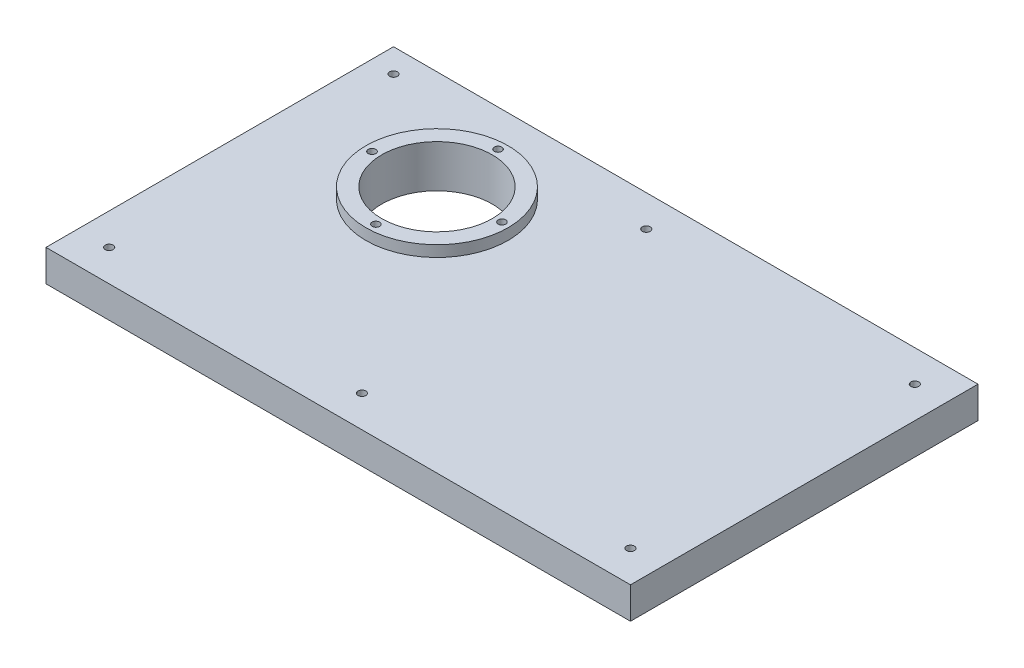
ISO-10303-21;
HEADER;
FILE_DESCRIPTION(('STEP AP214'),'2;1');
FILE_NAME('part.step','',(''),(''),'','','');
FILE_SCHEMA(('AUTOMOTIVE_DESIGN { 1 0 10303 214 1 1 1 1 }'));
ENDSEC;
DATA;
#1=APPLICATION_CONTEXT('core data for automotive mechanical design processes');
#2=APPLICATION_PROTOCOL_DEFINITION('international standard','automotive_design',2000,#1);
#3=PRODUCT_CONTEXT('',#1,'mechanical');
#4=PRODUCT('Part','Part','',(#3));
#5=PRODUCT_RELATED_PRODUCT_CATEGORY('part','',(#4));
#6=PRODUCT_DEFINITION_FORMATION('','',#4);
#7=PRODUCT_DEFINITION_CONTEXT('part definition',#1,'design');
#8=PRODUCT_DEFINITION('design','',#6,#7);
#9=PRODUCT_DEFINITION_SHAPE('','',#8);
#10=(LENGTH_UNIT() NAMED_UNIT(*) SI_UNIT(.MILLI.,.METRE.));
#11=(NAMED_UNIT(*) PLANE_ANGLE_UNIT() SI_UNIT($,.RADIAN.));
#12=(NAMED_UNIT(*) SI_UNIT($,.STERADIAN.) SOLID_ANGLE_UNIT());
#13=UNCERTAINTY_MEASURE_WITH_UNIT(LENGTH_MEASURE(1.E-05),#10,'distance_accuracy_value','');
#14=(GEOMETRIC_REPRESENTATION_CONTEXT(3) GLOBAL_UNCERTAINTY_ASSIGNED_CONTEXT((#13)) GLOBAL_UNIT_ASSIGNED_CONTEXT((#10,
#11,#12)) REPRESENTATION_CONTEXT('',''));
#15=CARTESIAN_POINT('',(0.,0.,0.));
#16=DIRECTION('',(0.,0.,1.));
#17=DIRECTION('',(1.,0.,0.));
#18=AXIS2_PLACEMENT_3D('',#15,#16,#17);
#19=CARTESIAN_POINT('',(0.,0.,0.));
#20=DIRECTION('',(0.,1.,0.));
#21=DIRECTION('',(0.,0.,1.));
#22=AXIS2_PLACEMENT_3D('',#19,#20,#21);
#23=PLANE('',#22);
#24=CARTESIAN_POINT('',(15.,0.,-3.98961965134706));
#25=DIRECTION('',(0.,1.,0.));
#26=DIRECTION('',(0.,0.,1.));
#27=AXIS2_PLACEMENT_3D('',#24,#25,#26);
#28=CIRCLE('',#27,2.5);
#29=CARTESIAN_POINT('',(15.,0.,-1.48961965134706));
#30=VERTEX_POINT('',#29);
#31=EDGE_CURVE('E372',#30,#30,#28,.T.);
#32=ORIENTED_EDGE('',*,*,#31,.T.);
#33=EDGE_LOOP('',(#32));
#34=FACE_BOUND('',#33,.T.);
#35=CARTESIAN_POINT('',(20.,0.,181.010380348653));
#36=DIRECTION('',(0.,1.,0.));
#37=DIRECTION('',(0.,0.,1.));
#38=AXIS2_PLACEMENT_3D('',#35,#36,#37);
#39=CIRCLE('',#38,2.5);
#40=CARTESIAN_POINT('',(20.,0.,183.510380348653));
#41=VERTEX_POINT('',#40);
#42=EDGE_CURVE('E366',#41,#41,#39,.T.);
#43=ORIENTED_EDGE('',*,*,#42,.T.);
#44=EDGE_LOOP('',(#43));
#45=FACE_BOUND('',#44,.T.);
#46=CARTESIAN_POINT('',(350.,0.,1.01038034865295));
#47=DIRECTION('',(0.,1.,0.));
#48=DIRECTION('',(0.,0.,1.));
#49=AXIS2_PLACEMENT_3D('',#46,#47,#48);
#50=CIRCLE('',#49,2.50000000000002);
#51=CARTESIAN_POINT('',(350.,0.,3.51038034865297));
#52=VERTEX_POINT('',#51);
#53=EDGE_CURVE('E360',#52,#52,#50,.T.);
#54=ORIENTED_EDGE('',*,*,#53,.T.);
#55=EDGE_LOOP('',(#54));
#56=FACE_BOUND('',#55,.T.);
#57=CARTESIAN_POINT('',(350.,0.,181.010380348653));
#58=DIRECTION('',(0.,1.,0.));
#59=DIRECTION('',(0.,0.,1.));
#60=AXIS2_PLACEMENT_3D('',#57,#58,#59);
#61=CIRCLE('',#60,2.50000000000002);
#62=CARTESIAN_POINT('',(350.,0.,183.510380348653));
#63=VERTEX_POINT('',#62);
#64=EDGE_CURVE('E354',#63,#63,#61,.T.);
#65=ORIENTED_EDGE('',*,*,#64,.T.);
#66=EDGE_LOOP('',(#65));
#67=FACE_BOUND('',#66,.T.);
#68=CARTESIAN_POINT('',(180.,0.,1.01038034865294));
#69=DIRECTION('',(0.,1.,0.));
#70=DIRECTION('',(0.,0.,1.));
#71=AXIS2_PLACEMENT_3D('',#68,#69,#70);
#72=CIRCLE('',#71,2.5);
#73=CARTESIAN_POINT('',(180.,0.,3.51038034865294));
#74=VERTEX_POINT('',#73);
#75=EDGE_CURVE('E348',#74,#74,#72,.T.);
#76=ORIENTED_EDGE('',*,*,#75,.T.);
#77=EDGE_LOOP('',(#76));
#78=FACE_BOUND('',#77,.T.);
#79=CARTESIAN_POINT('',(180.,0.,181.010380348653));
#80=DIRECTION('',(0.,1.,0.));
#81=DIRECTION('',(0.,0.,1.));
#82=AXIS2_PLACEMENT_3D('',#79,#80,#81);
#83=CIRCLE('',#82,2.5);
#84=CARTESIAN_POINT('',(180.,0.,183.510380348653));
#85=VERTEX_POINT('',#84);
#86=EDGE_CURVE('E342',#85,#85,#83,.T.);
#87=ORIENTED_EDGE('',*,*,#86,.T.);
#88=EDGE_LOOP('',(#87));
#89=FACE_BOUND('',#88,.T.);
#90=CARTESIAN_POINT('',(97.5031075015856,0.,51.0103803486529));
#91=DIRECTION('',(0.,1.,0.));
#92=DIRECTION('',(0.,0.,1.));
#93=AXIS2_PLACEMENT_3D('',#90,#91,#92);
#94=CIRCLE('',#93,35.);
#95=CARTESIAN_POINT('',(97.5031075015856,0.,86.010380348653));
#96=VERTEX_POINT('',#95);
#97=EDGE_CURVE('E336',#96,#96,#94,.F.);
#98=ORIENTED_EDGE('',*,*,#97,.F.);
#99=EDGE_LOOP('',(#98));
#100=FACE_BOUND('',#99,.T.);
#101=CARTESIAN_POINT('',(96.2737123824547,0.,11.1155235358677));
#102=DIRECTION('',(0.,1.,0.));
#103=DIRECTION('',(0.,0.,1.));
#104=AXIS2_PLACEMENT_3D('',#101,#102,#103);
#105=CIRCLE('',#104,2.3778726155101);
#106=CARTESIAN_POINT('',(96.2737123824547,0.,13.4933961513778));
#107=VERTEX_POINT('',#106);
#108=EDGE_CURVE('E326',#107,#107,#105,.T.);
#109=ORIENTED_EDGE('',*,*,#108,.T.);
#110=EDGE_LOOP('',(#109));
#111=FACE_BOUND('',#110,.T.);
#112=CARTESIAN_POINT('',(137.397964314371,0.,49.7809852295221));
#113=DIRECTION('',(0.,1.,0.));
#114=DIRECTION('',(0.,0.,1.));
#115=AXIS2_PLACEMENT_3D('',#112,#113,#114);
#116=CIRCLE('',#115,2.3778726155101);
#117=CARTESIAN_POINT('',(137.397964314371,0.,52.1588578450322));
#118=VERTEX_POINT('',#117);
#119=EDGE_CURVE('E320',#118,#118,#116,.T.);
#120=ORIENTED_EDGE('',*,*,#119,.T.);
#121=EDGE_LOOP('',(#120));
#122=FACE_BOUND('',#121,.T.);
#123=CARTESIAN_POINT('',(98.7325026207163,0.,90.9052371614383));
#124=DIRECTION('',(0.,1.,0.));
#125=DIRECTION('',(0.,0.,1.));
#126=AXIS2_PLACEMENT_3D('',#123,#124,#125);
#127=CIRCLE('',#126,2.37787261551011);
#128=CARTESIAN_POINT('',(98.7325026207163,0.,93.2831097769484));
#129=VERTEX_POINT('',#128);
#130=EDGE_CURVE('E314',#129,#129,#127,.T.);
#131=ORIENTED_EDGE('',*,*,#130,.T.);
#132=EDGE_LOOP('',(#131));
#133=FACE_BOUND('',#132,.T.);
#134=CARTESIAN_POINT('',(57.6082506888003,0.,52.2397754677835));
#135=DIRECTION('',(0.,1.,0.));
#136=DIRECTION('',(0.,0.,1.));
#137=AXIS2_PLACEMENT_3D('',#134,#135,#136);
#138=CIRCLE('',#137,2.37787261551009);
#139=CARTESIAN_POINT('',(57.6082506888003,0.,54.6176480832936));
#140=VERTEX_POINT('',#139);
#141=EDGE_CURVE('E308',#140,#140,#138,.T.);
#142=ORIENTED_EDGE('',*,*,#141,.T.);
#143=EDGE_LOOP('',(#142));
#144=FACE_BOUND('',#143,.T.);
#145=CARTESIAN_POINT('',(355.537243956446,0.,186.278558398078));
#146=DIRECTION('',(0.,-1.,0.));
#147=DIRECTION('',(0.,0.,1.));
#148=AXIS2_PLACEMENT_3D('',#145,#146,#147);
#149=CIRCLE('',#148,5.);
#150=CARTESIAN_POINT('',(360.537243956446,0.,186.278558398078));
#151=VERTEX_POINT('',#150);
#152=CARTESIAN_POINT('',(355.537243956446,0.,191.278558398078));
#153=VERTEX_POINT('',#152);
#154=EDGE_CURVE('E216',#151,#153,#149,.T.);
#155=ORIENTED_EDGE('',*,*,#154,.T.);
#156=DIRECTION('',(-1.,0.,0.));
#157=VECTOR('',#156,1.);
#158=CARTESIAN_POINT('',(12.8323791647015,0.,191.278558398078));
#159=LINE('',#158,#157);
#160=CARTESIAN_POINT('',(12.8323791647015,0.,191.278558398078));
#161=VERTEX_POINT('',#160);
#162=EDGE_CURVE('E175',#153,#161,#159,.T.);
#163=ORIENTED_EDGE('',*,*,#162,.T.);
#164=CARTESIAN_POINT('',(12.8323791647014,0.,186.278558398078));
#165=DIRECTION('',(0.,-1.,0.));
#166=DIRECTION('',(0.,0.,-1.));
#167=AXIS2_PLACEMENT_3D('',#164,#165,#166);
#168=CIRCLE('',#167,5.);
#169=CARTESIAN_POINT('',(7.83237916470142,0.,186.278558398078));
#170=VERTEX_POINT('',#169);
#171=EDGE_CURVE('E55',#161,#170,#168,.T.);
#172=ORIENTED_EDGE('',*,*,#171,.T.);
#173=DIRECTION('',(0.,0.,-1.));
#174=VECTOR('',#173,1.);
#175=CARTESIAN_POINT('',(7.83237916470142,0.,186.278558398078));
#176=LINE('',#175,#174);
#177=CARTESIAN_POINT('',(7.83237916470142,0.,-4.25779770077204));
#178=VERTEX_POINT('',#177);
#179=EDGE_CURVE('E220',#170,#178,#176,.T.);
#180=ORIENTED_EDGE('',*,*,#179,.T.);
#181=CARTESIAN_POINT('',(12.8323791647014,0.,-4.25779770077208));
#182=DIRECTION('',(0.,-1.,0.));
#183=DIRECTION('',(0.,0.,-1.));
#184=AXIS2_PLACEMENT_3D('',#181,#182,#183);
#185=CIRCLE('',#184,5.);
#186=CARTESIAN_POINT('',(12.8323791647015,0.,-9.25779770077208));
#187=VERTEX_POINT('',#186);
#188=EDGE_CURVE('E223',#178,#187,#185,.T.);
#189=ORIENTED_EDGE('',*,*,#188,.T.);
#190=DIRECTION('',(1.,0.,0.));
#191=VECTOR('',#190,1.);
#192=CARTESIAN_POINT('',(12.8323791647015,0.,-9.25779770077208));
#193=LINE('',#192,#191);
#194=CARTESIAN_POINT('',(355.537243956446,0.,-9.25779770077208));
#195=VERTEX_POINT('',#194);
#196=EDGE_CURVE('E226',#187,#195,#193,.T.);
#197=ORIENTED_EDGE('',*,*,#196,.T.);
#198=CARTESIAN_POINT('',(355.537243956446,0.,-4.25779770077208));
#199=DIRECTION('',(0.,-1.,0.));
#200=DIRECTION('',(0.,0.,1.));
#201=AXIS2_PLACEMENT_3D('',#198,#199,#200);
#202=CIRCLE('',#201,5.);
#203=CARTESIAN_POINT('',(360.537243956446,0.,-4.25779770077204));
#204=VERTEX_POINT('',#203);
#205=EDGE_CURVE('E199',#195,#204,#202,.T.);
#206=ORIENTED_EDGE('',*,*,#205,.T.);
#207=DIRECTION('',(0.,0.,1.));
#208=VECTOR('',#207,1.);
#209=CARTESIAN_POINT('',(360.537243956446,0.,186.278558398078));
#210=LINE('',#209,#208);
#211=EDGE_CURVE('E196',#204,#151,#210,.T.);
#212=ORIENTED_EDGE('',*,*,#211,.T.);
#213=EDGE_LOOP('',(#155,#163,#172,#180,#189,#197,#206,#212));
#214=FACE_BOUND('',#213,.T.);
#215=ADVANCED_FACE('F32',(#34,#45,#56,#67,#78,#89,#100,#111,#122,#133,#144,#214),#23,.F.);
#216=CARTESIAN_POINT('',(0.,20.,0.));
#217=DIRECTION('',(0.,1.,0.));
#218=DIRECTION('',(0.,0.,1.));
#219=AXIS2_PLACEMENT_3D('',#216,#217,#218);
#220=PLANE('',#219);
#221=DIRECTION('',(0.,0.,1.));
#222=VECTOR('',#221,1.);
#223=CARTESIAN_POINT('',(0.,20.,-18.9896196513471));
#224=LINE('',#223,#222);
#225=CARTESIAN_POINT('',(0.,20.,-18.9896196513471));
#226=VERTEX_POINT('',#225);
#227=CARTESIAN_POINT('',(0.,20.,201.010380348653));
#228=VERTEX_POINT('',#227);
#229=EDGE_CURVE('E378',#226,#228,#224,.T.);
#230=ORIENTED_EDGE('',*,*,#229,.T.);
#231=DIRECTION('',(1.,0.,0.));
#232=VECTOR('',#231,1.);
#233=CARTESIAN_POINT('',(0.,20.,201.010380348653));
#234=LINE('',#233,#232);
#235=CARTESIAN_POINT('',(370.,20.,201.010380348653));
#236=VERTEX_POINT('',#235);
#237=EDGE_CURVE('E381',#228,#236,#234,.T.);
#238=ORIENTED_EDGE('',*,*,#237,.T.);
#239=DIRECTION('',(0.,0.,-1.));
#240=VECTOR('',#239,1.);
#241=CARTESIAN_POINT('',(370.,20.,-18.9896196513471));
#242=LINE('',#241,#240);
#243=CARTESIAN_POINT('',(370.,20.,-18.9896196513471));
#244=VERTEX_POINT('',#243);
#245=EDGE_CURVE('E384',#236,#244,#242,.T.);
#246=ORIENTED_EDGE('',*,*,#245,.T.);
#247=DIRECTION('',(-1.,0.,0.));
#248=VECTOR('',#247,1.);
#249=CARTESIAN_POINT('',(0.,20.,-18.9896196513471));
#250=LINE('',#249,#248);
#251=EDGE_CURVE('E386',#244,#226,#250,.T.);
#252=ORIENTED_EDGE('',*,*,#251,.T.);
#253=EDGE_LOOP('',(#230,#238,#246,#252));
#254=FACE_BOUND('',#253,.T.);
#255=CARTESIAN_POINT('',(15.,20.,-3.98961965134706));
#256=DIRECTION('',(0.,1.,0.));
#257=DIRECTION('',(0.,0.,1.));
#258=AXIS2_PLACEMENT_3D('',#255,#256,#257);
#259=CIRCLE('',#258,2.5);
#260=CARTESIAN_POINT('',(15.,20.,-1.48961965134706));
#261=VERTEX_POINT('',#260);
#262=EDGE_CURVE('E369',#261,#261,#259,.T.);
#263=ORIENTED_EDGE('',*,*,#262,.F.);
#264=EDGE_LOOP('',(#263));
#265=FACE_BOUND('',#264,.T.);
#266=CARTESIAN_POINT('',(20.,20.,181.010380348653));
#267=DIRECTION('',(0.,1.,0.));
#268=DIRECTION('',(0.,0.,1.));
#269=AXIS2_PLACEMENT_3D('',#266,#267,#268);
#270=CIRCLE('',#269,2.5);
#271=CARTESIAN_POINT('',(20.,20.,183.510380348653));
#272=VERTEX_POINT('',#271);
#273=EDGE_CURVE('E363',#272,#272,#270,.T.);
#274=ORIENTED_EDGE('',*,*,#273,.F.);
#275=EDGE_LOOP('',(#274));
#276=FACE_BOUND('',#275,.T.);
#277=CARTESIAN_POINT('',(350.,20.,1.01038034865295));
#278=DIRECTION('',(0.,1.,0.));
#279=DIRECTION('',(0.,0.,1.));
#280=AXIS2_PLACEMENT_3D('',#277,#278,#279);
#281=CIRCLE('',#280,2.50000000000002);
#282=CARTESIAN_POINT('',(350.,20.,3.51038034865297));
#283=VERTEX_POINT('',#282);
#284=EDGE_CURVE('E357',#283,#283,#281,.T.);
#285=ORIENTED_EDGE('',*,*,#284,.F.);
#286=EDGE_LOOP('',(#285));
#287=FACE_BOUND('',#286,.T.);
#288=CARTESIAN_POINT('',(350.,20.,181.010380348653));
#289=DIRECTION('',(0.,1.,0.));
#290=DIRECTION('',(0.,0.,1.));
#291=AXIS2_PLACEMENT_3D('',#288,#289,#290);
#292=CIRCLE('',#291,2.50000000000002);
#293=CARTESIAN_POINT('',(350.,20.,183.510380348653));
#294=VERTEX_POINT('',#293);
#295=EDGE_CURVE('E351',#294,#294,#292,.T.);
#296=ORIENTED_EDGE('',*,*,#295,.F.);
#297=EDGE_LOOP('',(#296));
#298=FACE_BOUND('',#297,.T.);
#299=CARTESIAN_POINT('',(180.,20.,1.01038034865294));
#300=DIRECTION('',(0.,1.,0.));
#301=DIRECTION('',(0.,0.,1.));
#302=AXIS2_PLACEMENT_3D('',#299,#300,#301);
#303=CIRCLE('',#302,2.5);
#304=CARTESIAN_POINT('',(180.,20.,3.51038034865294));
#305=VERTEX_POINT('',#304);
#306=EDGE_CURVE('E345',#305,#305,#303,.T.);
#307=ORIENTED_EDGE('',*,*,#306,.F.);
#308=EDGE_LOOP('',(#307));
#309=FACE_BOUND('',#308,.T.);
#310=CARTESIAN_POINT('',(180.,20.,181.010380348653));
#311=DIRECTION('',(0.,1.,0.));
#312=DIRECTION('',(0.,0.,1.));
#313=AXIS2_PLACEMENT_3D('',#310,#311,#312);
#314=CIRCLE('',#313,2.5);
#315=CARTESIAN_POINT('',(180.,20.,183.510380348653));
#316=VERTEX_POINT('',#315);
#317=EDGE_CURVE('E341',#316,#316,#314,.T.);
#318=ORIENTED_EDGE('',*,*,#317,.F.);
#319=EDGE_LOOP('',(#318));
#320=FACE_BOUND('',#319,.T.);
#321=CARTESIAN_POINT('',(97.5031075015856,20.,51.0103803486529));
#322=DIRECTION('',(0.,1.,0.));
#323=DIRECTION('',(0.,0.,1.));
#324=AXIS2_PLACEMENT_3D('',#321,#322,#323);
#325=CIRCLE('',#324,45.);
#326=CARTESIAN_POINT('',(97.5031075015856,20.,96.0103803486529));
#327=VERTEX_POINT('',#326);
#328=EDGE_CURVE('E332',#327,#327,#325,.T.);
#329=ORIENTED_EDGE('',*,*,#328,.F.);
#330=EDGE_LOOP('',(#329));
#331=FACE_BOUND('',#330,.T.);
#332=ADVANCED_FACE('F420',(#254,#265,#276,#287,#298,#309,#320,#331),#220,.T.);
#333=CARTESIAN_POINT('',(0.,20.,-18.9896196513471));
#334=DIRECTION('',(1.,0.,0.));
#335=DIRECTION('',(0.,0.,-1.));
#336=AXIS2_PLACEMENT_3D('',#333,#334,#335);
#337=PLANE('',#336);
#338=DIRECTION('',(0.,0.,1.));
#339=VECTOR('',#338,1.);
#340=CARTESIAN_POINT('',(0.,0.,-18.9896196513471));
#341=LINE('',#340,#339);
#342=CARTESIAN_POINT('',(0.,0.,-18.9896196513471));
#343=VERTEX_POINT('',#342);
#344=CARTESIAN_POINT('',(0.,0.,201.010380348653));
#345=VERTEX_POINT('',#344);
#346=EDGE_CURVE('E375',#343,#345,#341,.T.);
#347=ORIENTED_EDGE('',*,*,#346,.T.);
#348=DIRECTION('',(0.,-1.,0.));
#349=VECTOR('',#348,1.);
#350=CARTESIAN_POINT('',(0.,20.,201.010380348653));
#351=LINE('',#350,#349);
#352=EDGE_CURVE('E11',#228,#345,#351,.T.);
#353=ORIENTED_EDGE('',*,*,#352,.F.);
#354=ORIENTED_EDGE('',*,*,#229,.F.);
#355=DIRECTION('',(0.,-1.,0.));
#356=VECTOR('',#355,1.);
#357=CARTESIAN_POINT('',(0.,20.,-18.9896196513471));
#358=LINE('',#357,#356);
#359=EDGE_CURVE('E388',#226,#343,#358,.T.);
#360=ORIENTED_EDGE('',*,*,#359,.T.);
#361=EDGE_LOOP('',(#347,#353,#354,#360));
#362=FACE_BOUND('',#361,.T.);
#363=ADVANCED_FACE('F34',(#362),#337,.F.);
#364=CARTESIAN_POINT('',(0.,20.,201.010380348653));
#365=DIRECTION('',(0.,0.,-1.));
#366=DIRECTION('',(-1.,0.,0.));
#367=AXIS2_PLACEMENT_3D('',#364,#365,#366);
#368=PLANE('',#367);
#369=DIRECTION('',(1.,0.,0.));
#370=VECTOR('',#369,1.);
#371=CARTESIAN_POINT('',(0.,0.,201.010380348653));
#372=LINE('',#371,#370);
#373=CARTESIAN_POINT('',(370.,0.,201.010380348653));
#374=VERTEX_POINT('',#373);
#375=EDGE_CURVE('E391',#345,#374,#372,.T.);
#376=ORIENTED_EDGE('',*,*,#375,.T.);
#377=DIRECTION('',(0.,-1.,0.));
#378=VECTOR('',#377,1.);
#379=CARTESIAN_POINT('',(370.,20.,201.010380348653));
#380=LINE('',#379,#378);
#381=EDGE_CURVE('E40',#236,#374,#380,.T.);
#382=ORIENTED_EDGE('',*,*,#381,.F.);
#383=ORIENTED_EDGE('',*,*,#237,.F.);
#384=ORIENTED_EDGE('',*,*,#352,.T.);
#385=EDGE_LOOP('',(#376,#382,#383,#384));
#386=FACE_BOUND('',#385,.T.);
#387=ADVANCED_FACE('F422',(#386),#368,.F.);
#388=CARTESIAN_POINT('',(370.,20.,-18.9896196513471));
#389=DIRECTION('',(-1.,0.,0.));
#390=DIRECTION('',(0.,0.,1.));
#391=AXIS2_PLACEMENT_3D('',#388,#389,#390);
#392=PLANE('',#391);
#393=DIRECTION('',(0.,0.,-1.));
#394=VECTOR('',#393,1.);
#395=CARTESIAN_POINT('',(370.,0.,-18.9896196513471));
#396=LINE('',#395,#394);
#397=CARTESIAN_POINT('',(370.,0.,-18.9896196513471));
#398=VERTEX_POINT('',#397);
#399=EDGE_CURVE('E393',#374,#398,#396,.T.);
#400=ORIENTED_EDGE('',*,*,#399,.T.);
#401=DIRECTION('',(0.,-1.,0.));
#402=VECTOR('',#401,1.);
#403=CARTESIAN_POINT('',(370.,20.,-18.9896196513471));
#404=LINE('',#403,#402);
#405=EDGE_CURVE('E398',#244,#398,#404,.T.);
#406=ORIENTED_EDGE('',*,*,#405,.F.);
#407=ORIENTED_EDGE('',*,*,#245,.F.);
#408=ORIENTED_EDGE('',*,*,#381,.T.);
#409=EDGE_LOOP('',(#400,#406,#407,#408));
#410=FACE_BOUND('',#409,.T.);
#411=ADVANCED_FACE('F405',(#410),#392,.F.);
#412=CARTESIAN_POINT('',(0.,20.,-18.9896196513471));
#413=DIRECTION('',(0.,0.,1.));
#414=DIRECTION('',(1.,0.,0.));
#415=AXIS2_PLACEMENT_3D('',#412,#413,#414);
#416=PLANE('',#415);
#417=DIRECTION('',(-1.,0.,0.));
#418=VECTOR('',#417,1.);
#419=CARTESIAN_POINT('',(0.,0.,-18.9896196513471));
#420=LINE('',#419,#418);
#421=EDGE_CURVE('E382',#398,#343,#420,.T.);
#422=ORIENTED_EDGE('',*,*,#421,.T.);
#423=ORIENTED_EDGE('',*,*,#359,.F.);
#424=ORIENTED_EDGE('',*,*,#251,.F.);
#425=ORIENTED_EDGE('',*,*,#405,.T.);
#426=EDGE_LOOP('',(#422,#423,#424,#425));
#427=FACE_BOUND('',#426,.T.);
#428=ADVANCED_FACE('F414',(#427),#416,.F.);
#429=DIRECTION('',(-1.,0.,0.));
#430=VECTOR('',#429,1.);
#431=CARTESIAN_POINT('',(9.02816644737909,0.,196.169689034635));
#432=LINE('',#431,#430);
#433=CARTESIAN_POINT('',(360.428374593003,0.,196.169689034635));
#434=VERTEX_POINT('',#433);
#435=CARTESIAN_POINT('',(9.02816644737909,0.,196.169689034635));
#436=VERTEX_POINT('',#435);
#437=EDGE_CURVE('E270',#434,#436,#432,.T.);
#438=ORIENTED_EDGE('',*,*,#437,.F.);
#439=CARTESIAN_POINT('',(360.428374593003,0.,191.169689034635));
#440=DIRECTION('',(0.,-1.,0.));
#441=DIRECTION('',(0.,0.,1.));
#442=AXIS2_PLACEMENT_3D('',#439,#440,#441);
#443=CIRCLE('',#442,5.);
#444=CARTESIAN_POINT('',(365.428374593003,0.,191.169689034635));
#445=VERTEX_POINT('',#444);
#446=EDGE_CURVE('E47',#445,#434,#443,.T.);
#447=ORIENTED_EDGE('',*,*,#446,.F.);
#448=DIRECTION('',(0.,0.,1.));
#449=VECTOR('',#448,1.);
#450=CARTESIAN_POINT('',(365.428374593003,0.,191.169689034635));
#451=LINE('',#450,#449);
#452=CARTESIAN_POINT('',(365.428374593003,0.,-9.69238729694681));
#453=VERTEX_POINT('',#452);
#454=EDGE_CURVE('E247',#453,#445,#451,.T.);
#455=ORIENTED_EDGE('',*,*,#454,.F.);
#456=CARTESIAN_POINT('',(360.428374593003,0.,-9.69238729694685));
#457=DIRECTION('',(0.,-1.,0.));
#458=DIRECTION('',(0.,0.,1.));
#459=AXIS2_PLACEMENT_3D('',#456,#457,#458);
#460=CIRCLE('',#459,5.);
#461=CARTESIAN_POINT('',(360.428374593003,0.,-14.6923872969468));
#462=VERTEX_POINT('',#461);
#463=EDGE_CURVE('E285',#462,#453,#460,.T.);
#464=ORIENTED_EDGE('',*,*,#463,.F.);
#465=DIRECTION('',(1.,0.,0.));
#466=VECTOR('',#465,1.);
#467=CARTESIAN_POINT('',(9.02816644737909,0.,-14.6923872969468));
#468=LINE('',#467,#466);
#469=CARTESIAN_POINT('',(9.02816644737909,0.,-14.6923872969468));
#470=VERTEX_POINT('',#469);
#471=EDGE_CURVE('E282',#470,#462,#468,.T.);
#472=ORIENTED_EDGE('',*,*,#471,.F.);
#473=CARTESIAN_POINT('',(9.02816644737905,0.,-9.69238729694685));
#474=DIRECTION('',(0.,-1.,0.));
#475=DIRECTION('',(0.,0.,-1.));
#476=AXIS2_PLACEMENT_3D('',#473,#474,#475);
#477=CIRCLE('',#476,5.);
#478=CARTESIAN_POINT('',(4.02816644737905,0.,-9.69238729694681));
#479=VERTEX_POINT('',#478);
#480=EDGE_CURVE('E279',#479,#470,#477,.T.);
#481=ORIENTED_EDGE('',*,*,#480,.F.);
#482=DIRECTION('',(0.,0.,-1.));
#483=VECTOR('',#482,1.);
#484=CARTESIAN_POINT('',(4.02816644737905,0.,191.169689034635));
#485=LINE('',#484,#483);
#486=CARTESIAN_POINT('',(4.02816644737905,0.,191.169689034635));
#487=VERTEX_POINT('',#486);
#488=EDGE_CURVE('E276',#487,#479,#485,.T.);
#489=ORIENTED_EDGE('',*,*,#488,.F.);
#490=CARTESIAN_POINT('',(9.02816644737905,0.,191.169689034635));
#491=DIRECTION('',(0.,-1.,0.));
#492=DIRECTION('',(0.,0.,1.));
#493=AXIS2_PLACEMENT_3D('',#490,#491,#492);
#494=CIRCLE('',#493,5.);
#495=EDGE_CURVE('E273',#436,#487,#494,.T.);
#496=ORIENTED_EDGE('',*,*,#495,.F.);
#497=EDGE_LOOP('',(#438,#447,#455,#464,#472,#481,#489,#496));
#498=FACE_BOUND('',#497,.T.);
#499=ORIENTED_EDGE('',*,*,#346,.F.);
#500=ORIENTED_EDGE('',*,*,#421,.F.);
#501=ORIENTED_EDGE('',*,*,#399,.F.);
#502=ORIENTED_EDGE('',*,*,#375,.F.);
#503=EDGE_LOOP('',(#499,#500,#501,#502));
#504=FACE_BOUND('',#503,.T.);
#505=ADVANCED_FACE('F411',(#498,#504),#23,.F.);
#506=CARTESIAN_POINT('',(15.,0.,-3.98961965134706));
#507=DIRECTION('',(0.,1.,0.));
#508=DIRECTION('',(0.,0.,1.));
#509=AXIS2_PLACEMENT_3D('',#506,#507,#508);
#510=CYLINDRICAL_SURFACE('',#509,2.5);
#511=ORIENTED_EDGE('',*,*,#31,.F.);
#512=EDGE_LOOP('',(#511));
#513=FACE_BOUND('',#512,.T.);
#514=ORIENTED_EDGE('',*,*,#262,.T.);
#515=EDGE_LOOP('',(#514));
#516=FACE_BOUND('',#515,.T.);
#517=ADVANCED_FACE('F439',(#513,#516),#510,.F.);
#518=CARTESIAN_POINT('',(20.,0.,181.010380348653));
#519=DIRECTION('',(0.,1.,0.));
#520=DIRECTION('',(0.,0.,1.));
#521=AXIS2_PLACEMENT_3D('',#518,#519,#520);
#522=CYLINDRICAL_SURFACE('',#521,2.5);
#523=ORIENTED_EDGE('',*,*,#42,.F.);
#524=EDGE_LOOP('',(#523));
#525=FACE_BOUND('',#524,.T.);
#526=ORIENTED_EDGE('',*,*,#273,.T.);
#527=EDGE_LOOP('',(#526));
#528=FACE_BOUND('',#527,.T.);
#529=ADVANCED_FACE('F445',(#525,#528),#522,.F.);
#530=CARTESIAN_POINT('',(350.,0.,1.01038034865295));
#531=DIRECTION('',(0.,1.,0.));
#532=DIRECTION('',(0.,0.,1.));
#533=AXIS2_PLACEMENT_3D('',#530,#531,#532);
#534=CYLINDRICAL_SURFACE('',#533,2.50000000000002);
#535=ORIENTED_EDGE('',*,*,#53,.F.);
#536=EDGE_LOOP('',(#535));
#537=FACE_BOUND('',#536,.T.);
#538=ORIENTED_EDGE('',*,*,#284,.T.);
#539=EDGE_LOOP('',(#538));
#540=FACE_BOUND('',#539,.T.);
#541=ADVANCED_FACE('F529',(#537,#540),#534,.F.);
#542=CARTESIAN_POINT('',(350.,0.,181.010380348653));
#543=DIRECTION('',(0.,1.,0.));
#544=DIRECTION('',(0.,0.,1.));
#545=AXIS2_PLACEMENT_3D('',#542,#543,#544);
#546=CYLINDRICAL_SURFACE('',#545,2.50000000000002);
#547=ORIENTED_EDGE('',*,*,#64,.F.);
#548=EDGE_LOOP('',(#547));
#549=FACE_BOUND('',#548,.T.);
#550=ORIENTED_EDGE('',*,*,#295,.T.);
#551=EDGE_LOOP('',(#550));
#552=FACE_BOUND('',#551,.T.);
#553=ADVANCED_FACE('F525',(#549,#552),#546,.F.);
#554=CARTESIAN_POINT('',(180.,0.,1.01038034865294));
#555=DIRECTION('',(0.,1.,0.));
#556=DIRECTION('',(0.,0.,1.));
#557=AXIS2_PLACEMENT_3D('',#554,#555,#556);
#558=CYLINDRICAL_SURFACE('',#557,2.5);
#559=ORIENTED_EDGE('',*,*,#75,.F.);
#560=EDGE_LOOP('',(#559));
#561=FACE_BOUND('',#560,.T.);
#562=ORIENTED_EDGE('',*,*,#306,.T.);
#563=EDGE_LOOP('',(#562));
#564=FACE_BOUND('',#563,.T.);
#565=ADVANCED_FACE('F521',(#561,#564),#558,.F.);
#566=CARTESIAN_POINT('',(180.,0.,181.010380348653));
#567=DIRECTION('',(0.,1.,0.));
#568=DIRECTION('',(0.,0.,1.));
#569=AXIS2_PLACEMENT_3D('',#566,#567,#568);
#570=CYLINDRICAL_SURFACE('',#569,2.5);
#571=ORIENTED_EDGE('',*,*,#86,.F.);
#572=EDGE_LOOP('',(#571));
#573=FACE_BOUND('',#572,.T.);
#574=ORIENTED_EDGE('',*,*,#317,.T.);
#575=EDGE_LOOP('',(#574));
#576=FACE_BOUND('',#575,.T.);
#577=ADVANCED_FACE('F517',(#573,#576),#570,.F.);
#578=CARTESIAN_POINT('',(97.5031075015856,-0.001000000000001,51.0103803486529));
#579=DIRECTION('',(0.,1.,0.));
#580=DIRECTION('',(0.,0.,1.));
#581=AXIS2_PLACEMENT_3D('',#578,#579,#580);
#582=CYLINDRICAL_SURFACE('',#581,35.);
#583=ORIENTED_EDGE('',*,*,#97,.T.);
#584=EDGE_LOOP('',(#583));
#585=FACE_BOUND('',#584,.T.);
#586=CARTESIAN_POINT('',(97.5031075015856,27.,51.0103803486529));
#587=DIRECTION('',(0.,1.,0.));
#588=DIRECTION('',(0.,0.,1.));
#589=AXIS2_PLACEMENT_3D('',#586,#587,#588);
#590=CIRCLE('',#589,35.);
#591=CARTESIAN_POINT('',(97.5031075015856,27.,86.010380348653));
#592=VERTEX_POINT('',#591);
#593=EDGE_CURVE('E329',#592,#592,#590,.T.);
#594=ORIENTED_EDGE('',*,*,#593,.T.);
#595=EDGE_LOOP('',(#594));
#596=FACE_BOUND('',#595,.T.);
#597=ADVANCED_FACE('F513',(#585,#596),#582,.F.);
#598=CARTESIAN_POINT('',(97.5031075015856,27.,51.0103803486529));
#599=DIRECTION('',(0.,-1.,0.));
#600=DIRECTION('',(0.,0.,-1.));
#601=AXIS2_PLACEMENT_3D('',#598,#599,#600);
#602=CYLINDRICAL_SURFACE('',#601,45.);
#603=CARTESIAN_POINT('',(97.5031075015856,27.,51.0103803486529));
#604=DIRECTION('',(0.,1.,0.));
#605=DIRECTION('',(0.,0.,1.));
#606=AXIS2_PLACEMENT_3D('',#603,#604,#605);
#607=CIRCLE('',#606,45.);
#608=CARTESIAN_POINT('',(97.5031075015856,27.,96.0103803486529));
#609=VERTEX_POINT('',#608);
#610=EDGE_CURVE('E333',#609,#609,#607,.T.);
#611=ORIENTED_EDGE('',*,*,#610,.F.);
#612=EDGE_LOOP('',(#611));
#613=FACE_BOUND('',#612,.T.);
#614=ORIENTED_EDGE('',*,*,#328,.T.);
#615=EDGE_LOOP('',(#614));
#616=FACE_BOUND('',#615,.T.);
#617=ADVANCED_FACE('F509',(#613,#616),#602,.T.);
#618=CARTESIAN_POINT('',(97.5031075015856,27.,51.0103803486529));
#619=DIRECTION('',(0.,1.,0.));
#620=DIRECTION('',(0.,0.,1.));
#621=AXIS2_PLACEMENT_3D('',#618,#619,#620);
#622=PLANE('',#621);
#623=CARTESIAN_POINT('',(57.6082506888003,27.,52.2397754677835));
#624=DIRECTION('',(0.,1.,0.));
#625=DIRECTION('',(0.,0.,1.));
#626=AXIS2_PLACEMENT_3D('',#623,#624,#625);
#627=CIRCLE('',#626,2.37787261551009);
#628=CARTESIAN_POINT('',(57.6082506888003,27.,54.6176480832936));
#629=VERTEX_POINT('',#628);
#630=EDGE_CURVE('E292',#629,#629,#627,.T.);
#631=ORIENTED_EDGE('',*,*,#630,.F.);
#632=EDGE_LOOP('',(#631));
#633=FACE_BOUND('',#632,.T.);
#634=CARTESIAN_POINT('',(98.7325026207163,27.,90.9052371614383));
#635=DIRECTION('',(0.,1.,0.));
#636=DIRECTION('',(0.,0.,1.));
#637=AXIS2_PLACEMENT_3D('',#634,#635,#636);
#638=CIRCLE('',#637,2.37787261551011);
#639=CARTESIAN_POINT('',(98.7325026207163,27.,93.2831097769484));
#640=VERTEX_POINT('',#639);
#641=EDGE_CURVE('E311',#640,#640,#638,.T.);
#642=ORIENTED_EDGE('',*,*,#641,.F.);
#643=EDGE_LOOP('',(#642));
#644=FACE_BOUND('',#643,.T.);
#645=CARTESIAN_POINT('',(137.397964314371,27.,49.7809852295221));
#646=DIRECTION('',(0.,1.,0.));
#647=DIRECTION('',(0.,0.,1.));
#648=AXIS2_PLACEMENT_3D('',#645,#646,#647);
#649=CIRCLE('',#648,2.3778726155101);
#650=CARTESIAN_POINT('',(137.397964314371,27.,52.1588578450322));
#651=VERTEX_POINT('',#650);
#652=EDGE_CURVE('E317',#651,#651,#649,.T.);
#653=ORIENTED_EDGE('',*,*,#652,.F.);
#654=EDGE_LOOP('',(#653));
#655=FACE_BOUND('',#654,.T.);
#656=CARTESIAN_POINT('',(96.2737123824547,27.,11.1155235358677));
#657=DIRECTION('',(0.,1.,0.));
#658=DIRECTION('',(0.,0.,1.));
#659=AXIS2_PLACEMENT_3D('',#656,#657,#658);
#660=CIRCLE('',#659,2.3778726155101);
#661=CARTESIAN_POINT('',(96.2737123824547,27.,13.4933961513778));
#662=VERTEX_POINT('',#661);
#663=EDGE_CURVE('E323',#662,#662,#660,.T.);
#664=ORIENTED_EDGE('',*,*,#663,.F.);
#665=EDGE_LOOP('',(#664));
#666=FACE_BOUND('',#665,.T.);
#667=ORIENTED_EDGE('',*,*,#593,.F.);
#668=EDGE_LOOP('',(#667));
#669=FACE_BOUND('',#668,.T.);
#670=ORIENTED_EDGE('',*,*,#610,.T.);
#671=EDGE_LOOP('',(#670));
#672=FACE_BOUND('',#671,.T.);
#673=ADVANCED_FACE('F505',(#633,#644,#655,#666,#669,#672),#622,.T.);
#674=CARTESIAN_POINT('',(96.2737123824547,-12.,11.1155235358677));
#675=DIRECTION('',(0.,1.,0.));
#676=DIRECTION('',(0.,0.,1.));
#677=AXIS2_PLACEMENT_3D('',#674,#675,#676);
#678=CYLINDRICAL_SURFACE('',#677,2.3778726155101);
#679=ORIENTED_EDGE('',*,*,#663,.T.);
#680=EDGE_LOOP('',(#679));
#681=FACE_BOUND('',#680,.T.);
#682=ORIENTED_EDGE('',*,*,#108,.F.);
#683=EDGE_LOOP('',(#682));
#684=FACE_BOUND('',#683,.T.);
#685=ADVANCED_FACE('F501',(#681,#684),#678,.F.);
#686=CARTESIAN_POINT('',(137.397964314371,-12.,49.7809852295221));
#687=DIRECTION('',(0.,1.,0.));
#688=DIRECTION('',(0.,0.,1.));
#689=AXIS2_PLACEMENT_3D('',#686,#687,#688);
#690=CYLINDRICAL_SURFACE('',#689,2.3778726155101);
#691=ORIENTED_EDGE('',*,*,#652,.T.);
#692=EDGE_LOOP('',(#691));
#693=FACE_BOUND('',#692,.T.);
#694=ORIENTED_EDGE('',*,*,#119,.F.);
#695=EDGE_LOOP('',(#694));
#696=FACE_BOUND('',#695,.T.);
#697=ADVANCED_FACE('F497',(#693,#696),#690,.F.);
#698=CARTESIAN_POINT('',(98.7325026207163,-12.,90.9052371614383));
#699=DIRECTION('',(0.,1.,0.));
#700=DIRECTION('',(0.,0.,1.));
#701=AXIS2_PLACEMENT_3D('',#698,#699,#700);
#702=CYLINDRICAL_SURFACE('',#701,2.37787261551011);
#703=ORIENTED_EDGE('',*,*,#641,.T.);
#704=EDGE_LOOP('',(#703));
#705=FACE_BOUND('',#704,.T.);
#706=ORIENTED_EDGE('',*,*,#130,.F.);
#707=EDGE_LOOP('',(#706));
#708=FACE_BOUND('',#707,.T.);
#709=ADVANCED_FACE('F493',(#705,#708),#702,.F.);
#710=CARTESIAN_POINT('',(57.6082506888003,-12.,52.2397754677835));
#711=DIRECTION('',(0.,1.,0.));
#712=DIRECTION('',(0.,0.,1.));
#713=AXIS2_PLACEMENT_3D('',#710,#711,#712);
#714=CYLINDRICAL_SURFACE('',#713,2.37787261551009);
#715=ORIENTED_EDGE('',*,*,#630,.T.);
#716=EDGE_LOOP('',(#715));
#717=FACE_BOUND('',#716,.T.);
#718=ORIENTED_EDGE('',*,*,#141,.F.);
#719=EDGE_LOOP('',(#718));
#720=FACE_BOUND('',#719,.T.);
#721=ADVANCED_FACE('F490',(#717,#720),#714,.F.);
#722=CARTESIAN_POINT('',(360.428374593003,5.,191.169689034635));
#723=DIRECTION('',(0.,-1.,0.));
#724=DIRECTION('',(0.,0.,-1.));
#725=AXIS2_PLACEMENT_3D('',#722,#723,#724);
#726=CYLINDRICAL_SURFACE('',#725,5.);
#727=ORIENTED_EDGE('',*,*,#446,.T.);
#728=DIRECTION('',(0.,-1.,0.));
#729=VECTOR('',#728,1.);
#730=CARTESIAN_POINT('',(360.428374593003,5.,196.169689034635));
#731=LINE('',#730,#729);
#732=CARTESIAN_POINT('',(360.428374593003,5.,196.169689034635));
#733=VERTEX_POINT('',#732);
#734=EDGE_CURVE('E268',#733,#434,#731,.T.);
#735=ORIENTED_EDGE('',*,*,#734,.F.);
#736=CARTESIAN_POINT('',(360.428374593003,5.,191.169689034635));
#737=DIRECTION('',(0.,-1.,0.));
#738=DIRECTION('',(0.,0.,1.));
#739=AXIS2_PLACEMENT_3D('',#736,#737,#738);
#740=CIRCLE('',#739,5.);
#741=CARTESIAN_POINT('',(365.428374593003,5.,191.169689034635));
#742=VERTEX_POINT('',#741);
#743=EDGE_CURVE('E243',#742,#733,#740,.T.);
#744=ORIENTED_EDGE('',*,*,#743,.F.);
#745=DIRECTION('',(0.,-1.,0.));
#746=VECTOR('',#745,1.);
#747=CARTESIAN_POINT('',(365.428374593003,5.,191.169689034635));
#748=LINE('',#747,#746);
#749=EDGE_CURVE('E290',#742,#445,#748,.T.);
#750=ORIENTED_EDGE('',*,*,#749,.T.);
#751=EDGE_LOOP('',(#727,#735,#744,#750));
#752=FACE_BOUND('',#751,.T.);
#753=ADVANCED_FACE('F457',(#752),#726,.F.);
#754=CARTESIAN_POINT('',(365.428374593003,5.,191.169689034635));
#755=DIRECTION('',(1.,0.,0.));
#756=DIRECTION('',(0.,0.,-1.));
#757=AXIS2_PLACEMENT_3D('',#754,#755,#756);
#758=PLANE('',#757);
#759=ORIENTED_EDGE('',*,*,#454,.T.);
#760=ORIENTED_EDGE('',*,*,#749,.F.);
#761=DIRECTION('',(0.,0.,1.));
#762=VECTOR('',#761,1.);
#763=CARTESIAN_POINT('',(365.428374593003,5.,191.169689034635));
#764=LINE('',#763,#762);
#765=CARTESIAN_POINT('',(365.428374593003,5.,-9.69238729694681));
#766=VERTEX_POINT('',#765);
#767=EDGE_CURVE('E265',#766,#742,#764,.T.);
#768=ORIENTED_EDGE('',*,*,#767,.F.);
#769=DIRECTION('',(0.,-1.,0.));
#770=VECTOR('',#769,1.);
#771=CARTESIAN_POINT('',(365.428374593003,5.,-9.69238729694681));
#772=LINE('',#771,#770);
#773=EDGE_CURVE('E293',#766,#453,#772,.T.);
#774=ORIENTED_EDGE('',*,*,#773,.T.);
#775=EDGE_LOOP('',(#759,#760,#768,#774));
#776=FACE_BOUND('',#775,.T.);
#777=ADVANCED_FACE('F461',(#776),#758,.F.);
#778=CARTESIAN_POINT('',(360.428374593003,5.,-9.69238729694685));
#779=DIRECTION('',(0.,-1.,0.));
#780=DIRECTION('',(0.,0.,-1.));
#781=AXIS2_PLACEMENT_3D('',#778,#779,#780);
#782=CYLINDRICAL_SURFACE('',#781,5.);
#783=ORIENTED_EDGE('',*,*,#463,.T.);
#784=ORIENTED_EDGE('',*,*,#773,.F.);
#785=CARTESIAN_POINT('',(360.428374593003,5.,-9.69238729694685));
#786=DIRECTION('',(0.,-1.,0.));
#787=DIRECTION('',(0.,0.,1.));
#788=AXIS2_PLACEMENT_3D('',#785,#786,#787);
#789=CIRCLE('',#788,5.);
#790=CARTESIAN_POINT('',(360.428374593003,5.,-14.6923872969468));
#791=VERTEX_POINT('',#790);
#792=EDGE_CURVE('E262',#791,#766,#789,.T.);
#793=ORIENTED_EDGE('',*,*,#792,.F.);
#794=DIRECTION('',(0.,-1.,0.));
#795=VECTOR('',#794,1.);
#796=CARTESIAN_POINT('',(360.428374593003,5.,-14.6923872969468));
#797=LINE('',#796,#795);
#798=EDGE_CURVE('E295',#791,#462,#797,.T.);
#799=ORIENTED_EDGE('',*,*,#798,.T.);
#800=EDGE_LOOP('',(#783,#784,#793,#799));
#801=FACE_BOUND('',#800,.T.);
#802=ADVANCED_FACE('F466',(#801),#782,.F.);
#803=CARTESIAN_POINT('',(9.02816644737909,5.,-14.6923872969468));
#804=DIRECTION('',(0.,0.,-1.));
#805=DIRECTION('',(-1.,0.,0.));
#806=AXIS2_PLACEMENT_3D('',#803,#804,#805);
#807=PLANE('',#806);
#808=ORIENTED_EDGE('',*,*,#471,.T.);
#809=ORIENTED_EDGE('',*,*,#798,.F.);
#810=DIRECTION('',(1.,0.,0.));
#811=VECTOR('',#810,1.);
#812=CARTESIAN_POINT('',(9.02816644737909,5.,-14.6923872969468));
#813=LINE('',#812,#811);
#814=CARTESIAN_POINT('',(9.02816644737909,5.,-14.6923872969468));
#815=VERTEX_POINT('',#814);
#816=EDGE_CURVE('E259',#815,#791,#813,.T.);
#817=ORIENTED_EDGE('',*,*,#816,.F.);
#818=DIRECTION('',(0.,-1.,0.));
#819=VECTOR('',#818,1.);
#820=CARTESIAN_POINT('',(9.02816644737909,5.,-14.6923872969468));
#821=LINE('',#820,#819);
#822=EDGE_CURVE('E297',#815,#470,#821,.T.);
#823=ORIENTED_EDGE('',*,*,#822,.T.);
#824=EDGE_LOOP('',(#808,#809,#817,#823));
#825=FACE_BOUND('',#824,.T.);
#826=ADVANCED_FACE('F469',(#825),#807,.F.);
#827=CARTESIAN_POINT('',(9.02816644737905,5.,-9.69238729694685));
#828=DIRECTION('',(0.,-1.,0.));
#829=DIRECTION('',(0.,0.,-1.));
#830=AXIS2_PLACEMENT_3D('',#827,#828,#829);
#831=CYLINDRICAL_SURFACE('',#830,5.);
#832=ORIENTED_EDGE('',*,*,#480,.T.);
#833=ORIENTED_EDGE('',*,*,#822,.F.);
#834=CARTESIAN_POINT('',(9.02816644737905,5.,-9.69238729694685));
#835=DIRECTION('',(0.,-1.,0.));
#836=DIRECTION('',(0.,0.,-1.));
#837=AXIS2_PLACEMENT_3D('',#834,#835,#836);
#838=CIRCLE('',#837,5.);
#839=CARTESIAN_POINT('',(4.02816644737905,5.,-9.69238729694681));
#840=VERTEX_POINT('',#839);
#841=EDGE_CURVE('E256',#840,#815,#838,.T.);
#842=ORIENTED_EDGE('',*,*,#841,.F.);
#843=DIRECTION('',(0.,-1.,0.));
#844=VECTOR('',#843,1.);
#845=CARTESIAN_POINT('',(4.02816644737905,5.,-9.69238729694681));
#846=LINE('',#845,#844);
#847=EDGE_CURVE('E299',#840,#479,#846,.T.);
#848=ORIENTED_EDGE('',*,*,#847,.T.);
#849=EDGE_LOOP('',(#832,#833,#842,#848));
#850=FACE_BOUND('',#849,.T.);
#851=ADVANCED_FACE('F472',(#850),#831,.F.);
#852=CARTESIAN_POINT('',(4.02816644737905,5.,191.169689034635));
#853=DIRECTION('',(-1.,0.,0.));
#854=DIRECTION('',(0.,0.,1.));
#855=AXIS2_PLACEMENT_3D('',#852,#853,#854);
#856=PLANE('',#855);
#857=ORIENTED_EDGE('',*,*,#488,.T.);
#858=ORIENTED_EDGE('',*,*,#847,.F.);
#859=DIRECTION('',(0.,0.,-1.));
#860=VECTOR('',#859,1.);
#861=CARTESIAN_POINT('',(4.02816644737905,5.,191.169689034635));
#862=LINE('',#861,#860);
#863=CARTESIAN_POINT('',(4.02816644737905,5.,191.169689034635));
#864=VERTEX_POINT('',#863);
#865=EDGE_CURVE('E253',#864,#840,#862,.T.);
#866=ORIENTED_EDGE('',*,*,#865,.F.);
#867=DIRECTION('',(0.,-1.,0.));
#868=VECTOR('',#867,1.);
#869=CARTESIAN_POINT('',(4.02816644737905,5.,191.169689034635));
#870=LINE('',#869,#868);
#871=EDGE_CURVE('E301',#864,#487,#870,.T.);
#872=ORIENTED_EDGE('',*,*,#871,.T.);
#873=EDGE_LOOP('',(#857,#858,#866,#872));
#874=FACE_BOUND('',#873,.T.);
#875=ADVANCED_FACE('F474',(#874),#856,.F.);
#876=CARTESIAN_POINT('',(9.02816644737905,5.,191.169689034635));
#877=DIRECTION('',(0.,-1.,0.));
#878=DIRECTION('',(0.,0.,-1.));
#879=AXIS2_PLACEMENT_3D('',#876,#877,#878);
#880=CYLINDRICAL_SURFACE('',#879,5.);
#881=ORIENTED_EDGE('',*,*,#495,.T.);
#882=ORIENTED_EDGE('',*,*,#871,.F.);
#883=CARTESIAN_POINT('',(9.02816644737905,5.,191.169689034635));
#884=DIRECTION('',(0.,-1.,0.));
#885=DIRECTION('',(0.,0.,1.));
#886=AXIS2_PLACEMENT_3D('',#883,#884,#885);
#887=CIRCLE('',#886,5.);
#888=CARTESIAN_POINT('',(9.02816644737909,5.,196.169689034635));
#889=VERTEX_POINT('',#888);
#890=EDGE_CURVE('E250',#889,#864,#887,.T.);
#891=ORIENTED_EDGE('',*,*,#890,.F.);
#892=DIRECTION('',(0.,-1.,0.));
#893=VECTOR('',#892,1.);
#894=CARTESIAN_POINT('',(9.02816644737909,5.,196.169689034635));
#895=LINE('',#894,#893);
#896=EDGE_CURVE('E303',#889,#436,#895,.T.);
#897=ORIENTED_EDGE('',*,*,#896,.T.);
#898=EDGE_LOOP('',(#881,#882,#891,#897));
#899=FACE_BOUND('',#898,.T.);
#900=ADVANCED_FACE('F477',(#899),#880,.F.);
#901=CARTESIAN_POINT('',(9.02816644737909,5.,196.169689034635));
#902=DIRECTION('',(0.,0.,1.));
#903=DIRECTION('',(1.,0.,0.));
#904=AXIS2_PLACEMENT_3D('',#901,#902,#903);
#905=PLANE('',#904);
#906=ORIENTED_EDGE('',*,*,#437,.T.);
#907=ORIENTED_EDGE('',*,*,#896,.F.);
#908=DIRECTION('',(-1.,0.,0.));
#909=VECTOR('',#908,1.);
#910=CARTESIAN_POINT('',(9.02816644737909,5.,196.169689034635));
#911=LINE('',#910,#909);
#912=EDGE_CURVE('E246',#733,#889,#911,.T.);
#913=ORIENTED_EDGE('',*,*,#912,.F.);
#914=ORIENTED_EDGE('',*,*,#734,.T.);
#915=EDGE_LOOP('',(#906,#907,#913,#914));
#916=FACE_BOUND('',#915,.T.);
#917=ADVANCED_FACE('F453',(#916),#905,.F.);
#918=CARTESIAN_POINT('',(360.428374593003,5.,191.169689034635));
#919=DIRECTION('',(0.,1.,0.));
#920=DIRECTION('',(0.,0.,1.));
#921=AXIS2_PLACEMENT_3D('',#918,#919,#920);
#922=PLANE('',#921);
#923=CARTESIAN_POINT('',(355.537243956446,5.,186.278558398078));
#924=DIRECTION('',(0.,-1.,0.));
#925=DIRECTION('',(0.,0.,1.));
#926=AXIS2_PLACEMENT_3D('',#923,#924,#925);
#927=CIRCLE('',#926,5.);
#928=CARTESIAN_POINT('',(360.537243956446,5.,186.278558398078));
#929=VERTEX_POINT('',#928);
#930=CARTESIAN_POINT('',(355.537243956446,5.,191.278558398078));
#931=VERTEX_POINT('',#930);
#932=EDGE_CURVE('E188',#929,#931,#927,.T.);
#933=ORIENTED_EDGE('',*,*,#932,.F.);
#934=DIRECTION('',(0.,0.,1.));
#935=VECTOR('',#934,1.);
#936=CARTESIAN_POINT('',(360.537243956446,5.,186.278558398078));
#937=LINE('',#936,#935);
#938=CARTESIAN_POINT('',(360.537243956446,5.,-4.25779770077204));
#939=VERTEX_POINT('',#938);
#940=EDGE_CURVE('E181',#939,#929,#937,.T.);
#941=ORIENTED_EDGE('',*,*,#940,.F.);
#942=CARTESIAN_POINT('',(355.537243956446,5.,-4.25779770077208));
#943=DIRECTION('',(0.,-1.,0.));
#944=DIRECTION('',(0.,0.,1.));
#945=AXIS2_PLACEMENT_3D('',#942,#943,#944);
#946=CIRCLE('',#945,5.);
#947=CARTESIAN_POINT('',(355.537243956446,5.,-9.25779770077208));
#948=VERTEX_POINT('',#947);
#949=EDGE_CURVE('E212',#948,#939,#946,.T.);
#950=ORIENTED_EDGE('',*,*,#949,.F.);
#951=DIRECTION('',(1.,0.,0.));
#952=VECTOR('',#951,1.);
#953=CARTESIAN_POINT('',(12.8323791647015,5.,-9.25779770077208));
#954=LINE('',#953,#952);
#955=CARTESIAN_POINT('',(12.8323791647015,5.,-9.25779770077208));
#956=VERTEX_POINT('',#955);
#957=EDGE_CURVE('E209',#956,#948,#954,.T.);
#958=ORIENTED_EDGE('',*,*,#957,.F.);
#959=CARTESIAN_POINT('',(12.8323791647014,5.,-4.25779770077208));
#960=DIRECTION('',(0.,-1.,0.));
#961=DIRECTION('',(0.,0.,-1.));
#962=AXIS2_PLACEMENT_3D('',#959,#960,#961);
#963=CIRCLE('',#962,5.);
#964=CARTESIAN_POINT('',(7.83237916470142,5.,-4.25779770077204));
#965=VERTEX_POINT('',#964);
#966=EDGE_CURVE('E206',#965,#956,#963,.T.);
#967=ORIENTED_EDGE('',*,*,#966,.F.);
#968=DIRECTION('',(0.,0.,-1.));
#969=VECTOR('',#968,1.);
#970=CARTESIAN_POINT('',(7.83237916470142,5.,186.278558398078));
#971=LINE('',#970,#969);
#972=CARTESIAN_POINT('',(7.83237916470142,5.,186.278558398078));
#973=VERTEX_POINT('',#972);
#974=EDGE_CURVE('E203',#973,#965,#971,.T.);
#975=ORIENTED_EDGE('',*,*,#974,.F.);
#976=CARTESIAN_POINT('',(12.8323791647014,5.,186.278558398078));
#977=DIRECTION('',(0.,-1.,0.));
#978=DIRECTION('',(0.,0.,-1.));
#979=AXIS2_PLACEMENT_3D('',#976,#977,#978);
#980=CIRCLE('',#979,5.);
#981=CARTESIAN_POINT('',(12.8323791647014,5.,191.278558398078));
#982=VERTEX_POINT('',#981);
#983=EDGE_CURVE('E192',#982,#973,#980,.T.);
#984=ORIENTED_EDGE('',*,*,#983,.F.);
#985=DIRECTION('',(-1.,0.,0.));
#986=VECTOR('',#985,1.);
#987=CARTESIAN_POINT('',(12.8323791647015,5.,191.278558398078));
#988=LINE('',#987,#986);
#989=EDGE_CURVE('E173',#931,#982,#988,.T.);
#990=ORIENTED_EDGE('',*,*,#989,.F.);
#991=EDGE_LOOP('',(#933,#941,#950,#958,#967,#975,#984,#990));
#992=FACE_BOUND('',#991,.T.);
#993=ORIENTED_EDGE('',*,*,#743,.T.);
#994=ORIENTED_EDGE('',*,*,#912,.T.);
#995=ORIENTED_EDGE('',*,*,#890,.T.);
#996=ORIENTED_EDGE('',*,*,#865,.T.);
#997=ORIENTED_EDGE('',*,*,#841,.T.);
#998=ORIENTED_EDGE('',*,*,#816,.T.);
#999=ORIENTED_EDGE('',*,*,#792,.T.);
#1000=ORIENTED_EDGE('',*,*,#767,.T.);
#1001=EDGE_LOOP('',(#993,#994,#995,#996,#997,#998,#999,#1000));
#1002=FACE_BOUND('',#1001,.T.);
#1003=ADVANCED_FACE('F185',(#992,#1002),#922,.F.);
#1004=CARTESIAN_POINT('',(355.537243956446,5.,186.278558398078));
#1005=DIRECTION('',(0.,-1.,0.));
#1006=DIRECTION('',(0.,0.,-1.));
#1007=AXIS2_PLACEMENT_3D('',#1004,#1005,#1006);
#1008=CYLINDRICAL_SURFACE('',#1007,5.);
#1009=ORIENTED_EDGE('',*,*,#154,.F.);
#1010=DIRECTION('',(0.,-1.,0.));
#1011=VECTOR('',#1010,1.);
#1012=CARTESIAN_POINT('',(360.537243956446,5.,186.278558398078));
#1013=LINE('',#1012,#1011);
#1014=EDGE_CURVE('E195',#929,#151,#1013,.T.);
#1015=ORIENTED_EDGE('',*,*,#1014,.F.);
#1016=ORIENTED_EDGE('',*,*,#932,.T.);
#1017=DIRECTION('',(0.,-1.,0.));
#1018=VECTOR('',#1017,1.);
#1019=CARTESIAN_POINT('',(355.537243956446,5.,191.278558398078));
#1020=LINE('',#1019,#1018);
#1021=EDGE_CURVE('E170',#931,#153,#1020,.T.);
#1022=ORIENTED_EDGE('',*,*,#1021,.T.);
#1023=EDGE_LOOP('',(#1009,#1015,#1016,#1022));
#1024=FACE_BOUND('',#1023,.T.);
#1025=ADVANCED_FACE('F194',(#1024),#1008,.T.);
#1026=CARTESIAN_POINT('',(360.537243956446,5.,186.278558398078));
#1027=DIRECTION('',(1.,0.,0.));
#1028=DIRECTION('',(0.,0.,-1.));
#1029=AXIS2_PLACEMENT_3D('',#1026,#1027,#1028);
#1030=PLANE('',#1029);
#1031=ORIENTED_EDGE('',*,*,#211,.F.);
#1032=DIRECTION('',(0.,-1.,0.));
#1033=VECTOR('',#1032,1.);
#1034=CARTESIAN_POINT('',(360.537243956446,5.,-4.25779770077204));
#1035=LINE('',#1034,#1033);
#1036=EDGE_CURVE('E232',#939,#204,#1035,.T.);
#1037=ORIENTED_EDGE('',*,*,#1036,.F.);
#1038=ORIENTED_EDGE('',*,*,#940,.T.);
#1039=ORIENTED_EDGE('',*,*,#1014,.T.);
#1040=EDGE_LOOP('',(#1031,#1037,#1038,#1039));
#1041=FACE_BOUND('',#1040,.T.);
#1042=ADVANCED_FACE('F579',(#1041),#1030,.T.);
#1043=CARTESIAN_POINT('',(355.537243956446,5.,-4.25779770077208));
#1044=DIRECTION('',(0.,-1.,0.));
#1045=DIRECTION('',(0.,0.,-1.));
#1046=AXIS2_PLACEMENT_3D('',#1043,#1044,#1045);
#1047=CYLINDRICAL_SURFACE('',#1046,5.);
#1048=ORIENTED_EDGE('',*,*,#205,.F.);
#1049=DIRECTION('',(0.,-1.,0.));
#1050=VECTOR('',#1049,1.);
#1051=CARTESIAN_POINT('',(355.537243956446,5.,-9.25779770077208));
#1052=LINE('',#1051,#1050);
#1053=EDGE_CURVE('E234',#948,#195,#1052,.T.);
#1054=ORIENTED_EDGE('',*,*,#1053,.F.);
#1055=ORIENTED_EDGE('',*,*,#949,.T.);
#1056=ORIENTED_EDGE('',*,*,#1036,.T.);
#1057=EDGE_LOOP('',(#1048,#1054,#1055,#1056));
#1058=FACE_BOUND('',#1057,.T.);
#1059=ADVANCED_FACE('F583',(#1058),#1047,.T.);
#1060=CARTESIAN_POINT('',(12.8323791647015,5.,-9.25779770077208));
#1061=DIRECTION('',(0.,0.,-1.));
#1062=DIRECTION('',(-1.,0.,0.));
#1063=AXIS2_PLACEMENT_3D('',#1060,#1061,#1062);
#1064=PLANE('',#1063);
#1065=ORIENTED_EDGE('',*,*,#196,.F.);
#1066=DIRECTION('',(0.,-1.,0.));
#1067=VECTOR('',#1066,1.);
#1068=CARTESIAN_POINT('',(12.8323791647015,5.,-9.25779770077208));
#1069=LINE('',#1068,#1067);
#1070=EDGE_CURVE('E236',#956,#187,#1069,.T.);
#1071=ORIENTED_EDGE('',*,*,#1070,.F.);
#1072=ORIENTED_EDGE('',*,*,#957,.T.);
#1073=ORIENTED_EDGE('',*,*,#1053,.T.);
#1074=EDGE_LOOP('',(#1065,#1071,#1072,#1073));
#1075=FACE_BOUND('',#1074,.T.);
#1076=ADVANCED_FACE('F586',(#1075),#1064,.T.);
#1077=CARTESIAN_POINT('',(12.8323791647014,5.,-4.25779770077208));
#1078=DIRECTION('',(0.,-1.,0.));
#1079=DIRECTION('',(0.,0.,-1.));
#1080=AXIS2_PLACEMENT_3D('',#1077,#1078,#1079);
#1081=CYLINDRICAL_SURFACE('',#1080,5.);
#1082=ORIENTED_EDGE('',*,*,#188,.F.);
#1083=DIRECTION('',(0.,-1.,0.));
#1084=VECTOR('',#1083,1.);
#1085=CARTESIAN_POINT('',(7.83237916470142,5.,-4.25779770077204));
#1086=LINE('',#1085,#1084);
#1087=EDGE_CURVE('E238',#965,#178,#1086,.T.);
#1088=ORIENTED_EDGE('',*,*,#1087,.F.);
#1089=ORIENTED_EDGE('',*,*,#966,.T.);
#1090=ORIENTED_EDGE('',*,*,#1070,.T.);
#1091=EDGE_LOOP('',(#1082,#1088,#1089,#1090));
#1092=FACE_BOUND('',#1091,.T.);
#1093=ADVANCED_FACE('F590',(#1092),#1081,.T.);
#1094=CARTESIAN_POINT('',(7.83237916470142,5.,186.278558398078));
#1095=DIRECTION('',(-1.,0.,0.));
#1096=DIRECTION('',(0.,0.,1.));
#1097=AXIS2_PLACEMENT_3D('',#1094,#1095,#1096);
#1098=PLANE('',#1097);
#1099=ORIENTED_EDGE('',*,*,#179,.F.);
#1100=DIRECTION('',(0.,-1.,0.));
#1101=VECTOR('',#1100,1.);
#1102=CARTESIAN_POINT('',(7.83237916470142,5.,186.278558398078));
#1103=LINE('',#1102,#1101);
#1104=EDGE_CURVE('E240',#973,#170,#1103,.T.);
#1105=ORIENTED_EDGE('',*,*,#1104,.F.);
#1106=ORIENTED_EDGE('',*,*,#974,.T.);
#1107=ORIENTED_EDGE('',*,*,#1087,.T.);
#1108=EDGE_LOOP('',(#1099,#1105,#1106,#1107));
#1109=FACE_BOUND('',#1108,.T.);
#1110=ADVANCED_FACE('F593',(#1109),#1098,.T.);
#1111=CARTESIAN_POINT('',(12.8323791647014,5.,186.278558398078));
#1112=DIRECTION('',(0.,-1.,0.));
#1113=DIRECTION('',(0.,0.,-1.));
#1114=AXIS2_PLACEMENT_3D('',#1111,#1112,#1113);
#1115=CYLINDRICAL_SURFACE('',#1114,5.);
#1116=ORIENTED_EDGE('',*,*,#171,.F.);
#1117=DIRECTION('',(0.,-1.,0.));
#1118=VECTOR('',#1117,1.);
#1119=CARTESIAN_POINT('',(12.8323791647015,5.,191.278558398078));
#1120=LINE('',#1119,#1118);
#1121=EDGE_CURVE('E180',#982,#161,#1120,.T.);
#1122=ORIENTED_EDGE('',*,*,#1121,.F.);
#1123=ORIENTED_EDGE('',*,*,#983,.T.);
#1124=ORIENTED_EDGE('',*,*,#1104,.T.);
#1125=EDGE_LOOP('',(#1116,#1122,#1123,#1124));
#1126=FACE_BOUND('',#1125,.T.);
#1127=ADVANCED_FACE('F594',(#1126),#1115,.T.);
#1128=CARTESIAN_POINT('',(12.8323791647015,5.,191.278558398078));
#1129=DIRECTION('',(0.,0.,1.));
#1130=DIRECTION('',(1.,0.,0.));
#1131=AXIS2_PLACEMENT_3D('',#1128,#1129,#1130);
#1132=PLANE('',#1131);
#1133=ORIENTED_EDGE('',*,*,#162,.F.);
#1134=ORIENTED_EDGE('',*,*,#1021,.F.);
#1135=ORIENTED_EDGE('',*,*,#989,.T.);
#1136=ORIENTED_EDGE('',*,*,#1121,.T.);
#1137=EDGE_LOOP('',(#1133,#1134,#1135,#1136));
#1138=FACE_BOUND('',#1137,.T.);
#1139=ADVANCED_FACE('F172',(#1138),#1132,.T.);
#1140=CLOSED_SHELL('',(#215,#332,#363,#387,#411,#428,#505,#517,#529,#541,#553,#565,#577,#597,
#617,#673,#685,#697,#709,#721,#753,#777,#802,#826,#851,#875,#900,#917,#1003,#1025,#1042,#1059,
#1076,#1093,#1110,#1127,#1139));
#1141=MANIFOLD_SOLID_BREP('B2',#1140);
#1142=ADVANCED_BREP_SHAPE_REPRESENTATION('',(#18,#1141),#14);
#1143=SHAPE_DEFINITION_REPRESENTATION(#9,#1142);
ENDSEC;
END-ISO-10303-21;
